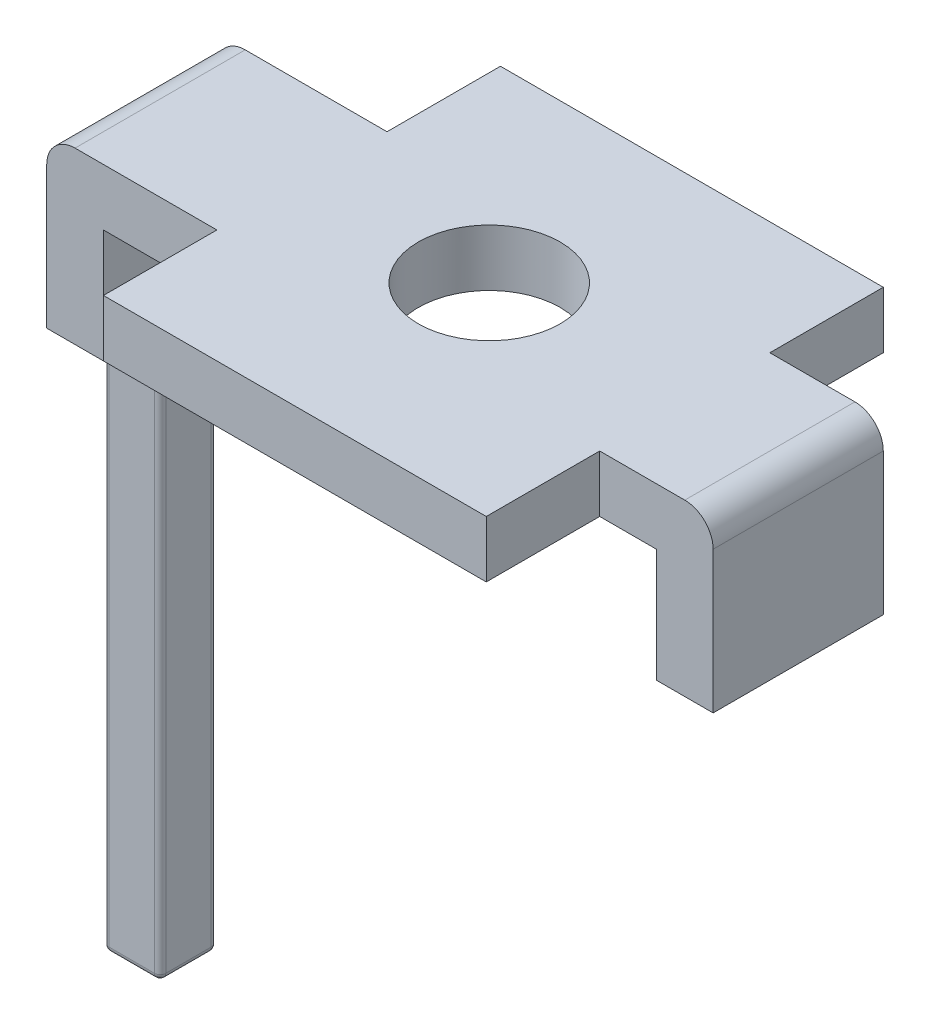
ISO-10303-21;
HEADER;
FILE_DESCRIPTION(('STEP AP214'),'2;1');
FILE_NAME('part.step','',(''),(''),'','','');
FILE_SCHEMA(('AUTOMOTIVE_DESIGN { 1 0 10303 214 1 1 1 1 }'));
ENDSEC;
DATA;
#1=APPLICATION_CONTEXT('core data for automotive mechanical design processes');
#2=APPLICATION_PROTOCOL_DEFINITION('international standard','automotive_design',2000,#1);
#3=PRODUCT_CONTEXT('',#1,'mechanical');
#4=PRODUCT('Part','Part','',(#3));
#5=PRODUCT_RELATED_PRODUCT_CATEGORY('part','',(#4));
#6=PRODUCT_DEFINITION_FORMATION('','',#4);
#7=PRODUCT_DEFINITION_CONTEXT('part definition',#1,'design');
#8=PRODUCT_DEFINITION('design','',#6,#7);
#9=PRODUCT_DEFINITION_SHAPE('','',#8);
#10=(LENGTH_UNIT() NAMED_UNIT(*) SI_UNIT(.MILLI.,.METRE.));
#11=(NAMED_UNIT(*) PLANE_ANGLE_UNIT() SI_UNIT($,.RADIAN.));
#12=(NAMED_UNIT(*) SI_UNIT($,.STERADIAN.) SOLID_ANGLE_UNIT());
#13=UNCERTAINTY_MEASURE_WITH_UNIT(LENGTH_MEASURE(1.E-05),#10,'distance_accuracy_value','');
#14=(GEOMETRIC_REPRESENTATION_CONTEXT(3) GLOBAL_UNCERTAINTY_ASSIGNED_CONTEXT((#13)) GLOBAL_UNIT_ASSIGNED_CONTEXT((#10,
#11,#12)) REPRESENTATION_CONTEXT('',''));
#15=CARTESIAN_POINT('',(0.,0.,0.));
#16=DIRECTION('',(0.,0.,1.));
#17=DIRECTION('',(1.,0.,0.));
#18=AXIS2_PLACEMENT_3D('',#15,#16,#17);
#19=CARTESIAN_POINT('',(2.90000000003594,-6.7,-37.1));
#20=DIRECTION('',(-0.408248290463865,-0.816496580927729,-0.408248290463856));
#21=DIRECTION('',(0.577350269189638,-0.577350269189615,0.577350269189624));
#22=AXIS2_PLACEMENT_3D('',#19,#20,#21);
#23=SPHERICAL_SURFACE('',#22,0.1);
#24=CARTESIAN_POINT('',(2.90000000003594,-6.7,-37.1));
#25=DIRECTION('',(-1.,0.,0.));
#26=DIRECTION('',(0.,-1.,0.));
#27=AXIS2_PLACEMENT_3D('',#24,#25,#26);
#28=CIRCLE('',#27,0.1);
#29=CARTESIAN_POINT('',(2.90000000003594,-6.8,-37.1));
#30=VERTEX_POINT('',#29);
#31=CARTESIAN_POINT('',(2.90000000003594,-6.7,-37.));
#32=VERTEX_POINT('',#31);
#33=EDGE_CURVE('E437',#30,#32,#28,.T.);
#34=ORIENTED_EDGE('',*,*,#33,.F.);
#35=CARTESIAN_POINT('',(2.90000000003594,-6.7,-37.1));
#36=DIRECTION('',(0.,0.,-1.));
#37=DIRECTION('',(1.,0.,0.));
#38=AXIS2_PLACEMENT_3D('',#35,#36,#37);
#39=CIRCLE('',#38,0.1);
#40=CARTESIAN_POINT('',(3.00000000003594,-6.7,-37.1));
#41=VERTEX_POINT('',#40);
#42=EDGE_CURVE('E42',#41,#30,#39,.T.);
#43=ORIENTED_EDGE('',*,*,#42,.F.);
#44=CARTESIAN_POINT('',(2.90000000003594,-6.7,-37.1));
#45=DIRECTION('',(0.,1.,0.));
#46=DIRECTION('',(0.,0.,1.));
#47=AXIS2_PLACEMENT_3D('',#44,#45,#46);
#48=CIRCLE('',#47,0.1);
#49=EDGE_CURVE('E450',#32,#41,#48,.T.);
#50=ORIENTED_EDGE('',*,*,#49,.F.);
#51=EDGE_LOOP('',(#34,#43,#50));
#52=FACE_BOUND('',#51,.T.);
#53=ADVANCED_FACE('F17',(#52),#23,.T.);
#54=CARTESIAN_POINT('',(2.90000000003594,-6.7,-37.9));
#55=DIRECTION('',(-0.408248290463865,-0.816496580927729,0.408248290463856));
#56=DIRECTION('',(0.577350269189638,-0.577350269189615,-0.577350269189624));
#57=AXIS2_PLACEMENT_3D('',#54,#55,#56);
#58=SPHERICAL_SURFACE('',#57,0.1);
#59=CARTESIAN_POINT('',(2.90000000003594,-6.7,-37.9));
#60=DIRECTION('',(0.,0.,1.));
#61=DIRECTION('',(0.,-1.,0.));
#62=AXIS2_PLACEMENT_3D('',#59,#60,#61);
#63=CIRCLE('',#62,0.1);
#64=CARTESIAN_POINT('',(2.90000000003594,-6.8,-37.9));
#65=VERTEX_POINT('',#64);
#66=CARTESIAN_POINT('',(3.00000000003594,-6.7,-37.9));
#67=VERTEX_POINT('',#66);
#68=EDGE_CURVE('E370',#65,#67,#63,.T.);
#69=ORIENTED_EDGE('',*,*,#68,.F.);
#70=CARTESIAN_POINT('',(2.90000000003594,-6.7,-37.9));
#71=DIRECTION('',(-1.,0.,0.));
#72=DIRECTION('',(0.,0.,-1.));
#73=AXIS2_PLACEMENT_3D('',#70,#71,#72);
#74=CIRCLE('',#73,0.1);
#75=CARTESIAN_POINT('',(2.90000000003594,-6.7,-38.));
#76=VERTEX_POINT('',#75);
#77=EDGE_CURVE('E533',#76,#65,#74,.T.);
#78=ORIENTED_EDGE('',*,*,#77,.F.);
#79=CARTESIAN_POINT('',(2.90000000003594,-6.7,-37.9));
#80=DIRECTION('',(0.,1.,0.));
#81=DIRECTION('',(1.,0.,0.));
#82=AXIS2_PLACEMENT_3D('',#79,#80,#81);
#83=CIRCLE('',#82,0.1);
#84=EDGE_CURVE('E383',#67,#76,#83,.T.);
#85=ORIENTED_EDGE('',*,*,#84,.F.);
#86=EDGE_LOOP('',(#69,#78,#85));
#87=FACE_BOUND('',#86,.T.);
#88=ADVANCED_FACE('F757',(#87),#58,.T.);
#89=CARTESIAN_POINT('',(2.10000000003594,-6.7,-37.1));
#90=DIRECTION('',(0.408248290463865,-0.816496580927729,-0.408248290463856));
#91=DIRECTION('',(-0.577350269189638,-0.577350269189615,0.577350269189624));
#92=AXIS2_PLACEMENT_3D('',#89,#90,#91);
#93=SPHERICAL_SURFACE('',#92,0.1);
#94=CARTESIAN_POINT('',(2.10000000003594,-6.7,-37.1));
#95=DIRECTION('',(0.,0.,-1.));
#96=DIRECTION('',(0.,-1.,0.));
#97=AXIS2_PLACEMENT_3D('',#94,#95,#96);
#98=CIRCLE('',#97,0.1);
#99=CARTESIAN_POINT('',(2.10000000003594,-6.8,-37.1));
#100=VERTEX_POINT('',#99);
#101=CARTESIAN_POINT('',(2.00000000003594,-6.7,-37.1));
#102=VERTEX_POINT('',#101);
#103=EDGE_CURVE('E407',#100,#102,#98,.T.);
#104=ORIENTED_EDGE('',*,*,#103,.F.);
#105=CARTESIAN_POINT('',(2.10000000003594,-6.7,-37.1));
#106=DIRECTION('',(1.,0.,0.));
#107=DIRECTION('',(0.,0.,1.));
#108=AXIS2_PLACEMENT_3D('',#105,#106,#107);
#109=CIRCLE('',#108,0.1);
#110=CARTESIAN_POINT('',(2.10000000003594,-6.7,-37.));
#111=VERTEX_POINT('',#110);
#112=EDGE_CURVE('E11',#111,#100,#109,.T.);
#113=ORIENTED_EDGE('',*,*,#112,.F.);
#114=CARTESIAN_POINT('',(2.10000000003594,-6.7,-37.1));
#115=DIRECTION('',(0.,1.,0.));
#116=DIRECTION('',(-1.,0.,0.));
#117=AXIS2_PLACEMENT_3D('',#114,#115,#116);
#118=CIRCLE('',#117,0.1);
#119=EDGE_CURVE('E365',#102,#111,#118,.T.);
#120=ORIENTED_EDGE('',*,*,#119,.F.);
#121=EDGE_LOOP('',(#104,#113,#120));
#122=FACE_BOUND('',#121,.T.);
#123=ADVANCED_FACE('F794',(#122),#93,.T.);
#124=CARTESIAN_POINT('',(2.50000002238594,-6.7,-37.1));
#125=DIRECTION('',(-1.,0.,0.));
#126=DIRECTION('',(0.,-0.707106781186548,0.707106781186548));
#127=AXIS2_PLACEMENT_3D('',#124,#125,#126);
#128=CYLINDRICAL_SURFACE('',#127,0.1);
#129=ORIENTED_EDGE('',*,*,#112,.T.);
#130=DIRECTION('',(1.,0.,0.));
#131=VECTOR('',#130,1.);
#132=CARTESIAN_POINT('',(2.50000002238594,-6.8,-37.1));
#133=LINE('',#132,#131);
#134=EDGE_CURVE('E28',#100,#30,#133,.T.);
#135=ORIENTED_EDGE('',*,*,#134,.T.);
#136=ORIENTED_EDGE('',*,*,#33,.T.);
#137=DIRECTION('',(-1.,0.,0.));
#138=VECTOR('',#137,1.);
#139=CARTESIAN_POINT('',(2.50000002238594,-6.7,-37.));
#140=LINE('',#139,#138);
#141=EDGE_CURVE('E492',#32,#111,#140,.T.);
#142=ORIENTED_EDGE('',*,*,#141,.T.);
#143=EDGE_LOOP('',(#129,#135,#136,#142));
#144=FACE_BOUND('',#143,.T.);
#145=ADVANCED_FACE('F752',(#144),#128,.T.);
#146=CARTESIAN_POINT('',(2.10000000003594,1.95,-37.1));
#147=DIRECTION('',(0.,1.,0.));
#148=DIRECTION('',(-0.707106781186548,0.,0.707106781186548));
#149=AXIS2_PLACEMENT_3D('',#146,#147,#148);
#150=CYLINDRICAL_SURFACE('',#149,0.1);
#151=CARTESIAN_POINT('',(2.10000000003594,3.2,-37.1));
#152=DIRECTION('',(0.,-1.,0.));
#153=DIRECTION('',(-0.707106781186548,0.,0.707106781186548));
#154=AXIS2_PLACEMENT_3D('',#151,#152,#153);
#155=CIRCLE('',#154,0.1);
#156=CARTESIAN_POINT('',(2.10000000003594,3.2,-37.));
#157=VERTEX_POINT('',#156);
#158=CARTESIAN_POINT('',(2.00000000003594,3.2,-37.1));
#159=VERTEX_POINT('',#158);
#160=EDGE_CURVE('E488',#157,#159,#155,.T.);
#161=ORIENTED_EDGE('',*,*,#160,.T.);
#162=DIRECTION('',(0.,-1.,0.));
#163=VECTOR('',#162,1.);
#164=CARTESIAN_POINT('',(2.00000000003594,1.95,-37.1));
#165=LINE('',#164,#163);
#166=EDGE_CURVE('E368',#159,#102,#165,.T.);
#167=ORIENTED_EDGE('',*,*,#166,.T.);
#168=ORIENTED_EDGE('',*,*,#119,.T.);
#169=DIRECTION('',(0.,1.,0.));
#170=VECTOR('',#169,1.);
#171=CARTESIAN_POINT('',(2.10000000003594,1.95,-37.));
#172=LINE('',#171,#170);
#173=EDGE_CURVE('E369',#111,#157,#172,.T.);
#174=ORIENTED_EDGE('',*,*,#173,.T.);
#175=EDGE_LOOP('',(#161,#167,#168,#174));
#176=FACE_BOUND('',#175,.T.);
#177=ADVANCED_FACE('F809',(#176),#150,.T.);
#178=CARTESIAN_POINT('',(2.10000000003594,-6.7,-37.9));
#179=DIRECTION('',(0.408248290463865,-0.816496580927729,0.408248290463856));
#180=DIRECTION('',(-0.577350269189638,-0.577350269189615,-0.577350269189624));
#181=AXIS2_PLACEMENT_3D('',#178,#179,#180);
#182=SPHERICAL_SURFACE('',#181,0.1);
#183=CARTESIAN_POINT('',(2.10000000003594,-6.7,-37.9));
#184=DIRECTION('',(0.,1.,0.));
#185=DIRECTION('',(0.,0.,-1.));
#186=AXIS2_PLACEMENT_3D('',#183,#184,#185);
#187=CIRCLE('',#186,0.1);
#188=CARTESIAN_POINT('',(2.10000000003594,-6.7,-38.));
#189=VERTEX_POINT('',#188);
#190=CARTESIAN_POINT('',(2.00000000003594,-6.7,-37.9));
#191=VERTEX_POINT('',#190);
#192=EDGE_CURVE('E429',#189,#191,#187,.T.);
#193=ORIENTED_EDGE('',*,*,#192,.F.);
#194=CARTESIAN_POINT('',(2.10000000003594,-6.7,-37.9));
#195=DIRECTION('',(1.,0.,0.));
#196=DIRECTION('',(0.,-1.,0.));
#197=AXIS2_PLACEMENT_3D('',#194,#195,#196);
#198=CIRCLE('',#197,0.1);
#199=CARTESIAN_POINT('',(2.10000000003594,-6.8,-37.9));
#200=VERTEX_POINT('',#199);
#201=EDGE_CURVE('E505',#200,#189,#198,.T.);
#202=ORIENTED_EDGE('',*,*,#201,.F.);
#203=CARTESIAN_POINT('',(2.10000000003594,-6.7,-37.9));
#204=DIRECTION('',(0.,0.,1.));
#205=DIRECTION('',(-1.,0.,0.));
#206=AXIS2_PLACEMENT_3D('',#203,#204,#205);
#207=CIRCLE('',#206,0.1);
#208=EDGE_CURVE('E558',#191,#200,#207,.T.);
#209=ORIENTED_EDGE('',*,*,#208,.F.);
#210=EDGE_LOOP('',(#193,#202,#209));
#211=FACE_BOUND('',#210,.T.);
#212=ADVANCED_FACE('F685',(#211),#182,.T.);
#213=CARTESIAN_POINT('',(2.50000002238594,-6.7,-37.9));
#214=DIRECTION('',(1.,0.,0.));
#215=DIRECTION('',(0.,-0.707106781186548,-0.707106781186548));
#216=AXIS2_PLACEMENT_3D('',#213,#214,#215);
#217=CYLINDRICAL_SURFACE('',#216,0.1);
#218=ORIENTED_EDGE('',*,*,#77,.T.);
#219=DIRECTION('',(-1.,0.,0.));
#220=VECTOR('',#219,1.);
#221=CARTESIAN_POINT('',(2.50000002238594,-6.8,-37.9));
#222=LINE('',#221,#220);
#223=EDGE_CURVE('E433',#65,#200,#222,.T.);
#224=ORIENTED_EDGE('',*,*,#223,.T.);
#225=ORIENTED_EDGE('',*,*,#201,.T.);
#226=DIRECTION('',(1.,0.,0.));
#227=VECTOR('',#226,1.);
#228=CARTESIAN_POINT('',(2.50000002238594,-6.7,-38.));
#229=LINE('',#228,#227);
#230=EDGE_CURVE('E509',#189,#76,#229,.T.);
#231=ORIENTED_EDGE('',*,*,#230,.T.);
#232=EDGE_LOOP('',(#218,#224,#225,#231));
#233=FACE_BOUND('',#232,.T.);
#234=ADVANCED_FACE('F19',(#233),#217,.T.);
#235=CARTESIAN_POINT('',(2.10000000003594,-6.7,-37.5));
#236=DIRECTION('',(0.,0.,-1.));
#237=DIRECTION('',(-0.707106781186548,-0.707106781186548,0.));
#238=AXIS2_PLACEMENT_3D('',#235,#236,#237);
#239=CYLINDRICAL_SURFACE('',#238,0.1);
#240=ORIENTED_EDGE('',*,*,#208,.T.);
#241=DIRECTION('',(0.,0.,1.));
#242=VECTOR('',#241,1.);
#243=CARTESIAN_POINT('',(2.10000000003594,-6.8,-37.5));
#244=LINE('',#243,#242);
#245=EDGE_CURVE('E415',#200,#100,#244,.T.);
#246=ORIENTED_EDGE('',*,*,#245,.T.);
#247=ORIENTED_EDGE('',*,*,#103,.T.);
#248=DIRECTION('',(0.,0.,-1.));
#249=VECTOR('',#248,1.);
#250=CARTESIAN_POINT('',(2.00000000003594,-6.7,-37.5));
#251=LINE('',#250,#249);
#252=EDGE_CURVE('E404',#102,#191,#251,.T.);
#253=ORIENTED_EDGE('',*,*,#252,.T.);
#254=EDGE_LOOP('',(#240,#246,#247,#253));
#255=FACE_BOUND('',#254,.T.);
#256=ADVANCED_FACE('F687',(#255),#239,.T.);
#257=CARTESIAN_POINT('',(2.10000000003594,1.95,-37.9));
#258=DIRECTION('',(0.,1.,0.));
#259=DIRECTION('',(-0.707106781186548,0.,-0.707106781186548));
#260=AXIS2_PLACEMENT_3D('',#257,#258,#259);
#261=CYLINDRICAL_SURFACE('',#260,0.1);
#262=CARTESIAN_POINT('',(2.10000000003594,3.2,-37.9));
#263=DIRECTION('',(0.,-1.,0.));
#264=DIRECTION('',(-0.707106781186548,0.,-0.707106781186548));
#265=AXIS2_PLACEMENT_3D('',#262,#263,#264);
#266=CIRCLE('',#265,0.1);
#267=CARTESIAN_POINT('',(2.00000000003594,3.2,-37.9));
#268=VERTEX_POINT('',#267);
#269=CARTESIAN_POINT('',(2.10000000003594,3.2,-38.));
#270=VERTEX_POINT('',#269);
#271=EDGE_CURVE('E408',#268,#270,#266,.T.);
#272=ORIENTED_EDGE('',*,*,#271,.T.);
#273=DIRECTION('',(0.,-1.,0.));
#274=VECTOR('',#273,1.);
#275=CARTESIAN_POINT('',(2.10000000003594,1.95,-38.));
#276=LINE('',#275,#274);
#277=EDGE_CURVE('E419',#270,#189,#276,.T.);
#278=ORIENTED_EDGE('',*,*,#277,.T.);
#279=ORIENTED_EDGE('',*,*,#192,.T.);
#280=DIRECTION('',(0.,1.,0.));
#281=VECTOR('',#280,1.);
#282=CARTESIAN_POINT('',(2.00000000003594,1.95,-37.9));
#283=LINE('',#282,#281);
#284=EDGE_CURVE('E378',#191,#268,#283,.T.);
#285=ORIENTED_EDGE('',*,*,#284,.T.);
#286=EDGE_LOOP('',(#272,#278,#279,#285));
#287=FACE_BOUND('',#286,.T.);
#288=ADVANCED_FACE('F648',(#287),#261,.T.);
#289=CARTESIAN_POINT('',(2.90000000003594,1.2,-37.9));
#290=DIRECTION('',(0.,1.,0.));
#291=DIRECTION('',(0.707106781186548,0.,-0.707106781186548));
#292=AXIS2_PLACEMENT_3D('',#289,#290,#291);
#293=CYLINDRICAL_SURFACE('',#292,0.1);
#294=CARTESIAN_POINT('',(2.90000000003594,3.2,-37.9));
#295=DIRECTION('',(0.,-1.,0.));
#296=DIRECTION('',(0.707106781186548,0.,-0.707106781186548));
#297=AXIS2_PLACEMENT_3D('',#294,#295,#296);
#298=CIRCLE('',#297,0.1);
#299=CARTESIAN_POINT('',(2.90000000003594,3.2,-38.));
#300=VERTEX_POINT('',#299);
#301=CARTESIAN_POINT('',(3.00000000003594,3.2,-37.9));
#302=VERTEX_POINT('',#301);
#303=EDGE_CURVE('E374',#300,#302,#298,.T.);
#304=ORIENTED_EDGE('',*,*,#303,.T.);
#305=DIRECTION('',(0.,-1.,0.));
#306=VECTOR('',#305,1.);
#307=CARTESIAN_POINT('',(3.00000000003594,1.2,-37.9));
#308=LINE('',#307,#306);
#309=EDGE_CURVE('E379',#302,#67,#308,.T.);
#310=ORIENTED_EDGE('',*,*,#309,.T.);
#311=ORIENTED_EDGE('',*,*,#84,.T.);
#312=DIRECTION('',(0.,1.,0.));
#313=VECTOR('',#312,1.);
#314=CARTESIAN_POINT('',(2.90000000003594,1.2,-38.));
#315=LINE('',#314,#313);
#316=EDGE_CURVE('E339',#76,#300,#315,.T.);
#317=ORIENTED_EDGE('',*,*,#316,.T.);
#318=EDGE_LOOP('',(#304,#310,#311,#317));
#319=FACE_BOUND('',#318,.T.);
#320=ADVANCED_FACE('F671',(#319),#293,.T.);
#321=CARTESIAN_POINT('',(2.90000000003594,-6.7,-37.5));
#322=DIRECTION('',(0.,0.,1.));
#323=DIRECTION('',(0.707106781186548,-0.707106781186548,0.));
#324=AXIS2_PLACEMENT_3D('',#321,#322,#323);
#325=CYLINDRICAL_SURFACE('',#324,0.1);
#326=ORIENTED_EDGE('',*,*,#42,.T.);
#327=DIRECTION('',(0.,0.,-1.));
#328=VECTOR('',#327,1.);
#329=CARTESIAN_POINT('',(2.90000000003594,-6.8,-37.5));
#330=LINE('',#329,#328);
#331=EDGE_CURVE('E340',#30,#65,#330,.T.);
#332=ORIENTED_EDGE('',*,*,#331,.T.);
#333=ORIENTED_EDGE('',*,*,#68,.T.);
#334=DIRECTION('',(0.,0.,1.));
#335=VECTOR('',#334,1.);
#336=CARTESIAN_POINT('',(3.00000000003594,-6.7,-37.5));
#337=LINE('',#336,#335);
#338=EDGE_CURVE('E360',#67,#41,#337,.T.);
#339=ORIENTED_EDGE('',*,*,#338,.T.);
#340=EDGE_LOOP('',(#326,#332,#333,#339));
#341=FACE_BOUND('',#340,.T.);
#342=ADVANCED_FACE('F749',(#341),#325,.T.);
#343=CARTESIAN_POINT('',(2.90000000003594,1.2,-37.1));
#344=DIRECTION('',(0.,1.,0.));
#345=DIRECTION('',(0.707106781186548,0.,0.707106781186548));
#346=AXIS2_PLACEMENT_3D('',#343,#344,#345);
#347=CYLINDRICAL_SURFACE('',#346,0.1);
#348=CARTESIAN_POINT('',(2.90000000003594,3.2,-37.1));
#349=DIRECTION('',(0.,-1.,0.));
#350=DIRECTION('',(0.707106781186548,0.,0.707106781186548));
#351=AXIS2_PLACEMENT_3D('',#348,#349,#350);
#352=CIRCLE('',#351,0.1);
#353=CARTESIAN_POINT('',(3.00000000003594,3.2,-37.1));
#354=VERTEX_POINT('',#353);
#355=CARTESIAN_POINT('',(2.90000000003594,3.2,-37.));
#356=VERTEX_POINT('',#355);
#357=EDGE_CURVE('E356',#354,#356,#352,.T.);
#358=ORIENTED_EDGE('',*,*,#357,.T.);
#359=DIRECTION('',(0.,-1.,0.));
#360=VECTOR('',#359,1.);
#361=CARTESIAN_POINT('',(2.90000000003594,1.2,-37.));
#362=LINE('',#361,#360);
#363=EDGE_CURVE('E361',#356,#32,#362,.T.);
#364=ORIENTED_EDGE('',*,*,#363,.T.);
#365=ORIENTED_EDGE('',*,*,#49,.T.);
#366=DIRECTION('',(0.,1.,0.));
#367=VECTOR('',#366,1.);
#368=CARTESIAN_POINT('',(3.00000000003594,1.2,-37.1));
#369=LINE('',#368,#367);
#370=EDGE_CURVE('E448',#41,#354,#369,.T.);
#371=ORIENTED_EDGE('',*,*,#370,.T.);
#372=EDGE_LOOP('',(#358,#364,#365,#371));
#373=FACE_BOUND('',#372,.T.);
#374=ADVANCED_FACE('F746',(#373),#347,.T.);
#375=CARTESIAN_POINT('',(2.00000000003594,5.7,-37.5));
#376=DIRECTION('',(-1.,0.,0.));
#377=DIRECTION('',(0.,0.,1.));
#378=AXIS2_PLACEMENT_3D('',#375,#376,#377);
#379=PLANE('',#378);
#380=DIRECTION('',(0.,0.,-1.));
#381=VECTOR('',#380,1.);
#382=CARTESIAN_POINT('',(2.00000000003594,3.2,-37.5));
#383=LINE('',#382,#381);
#384=CARTESIAN_POINT('',(2.00000000003594,3.2,-39.));
#385=VERTEX_POINT('',#384);
#386=EDGE_CURVE('E478',#268,#385,#383,.T.);
#387=ORIENTED_EDGE('',*,*,#386,.F.);
#388=ORIENTED_EDGE('',*,*,#284,.F.);
#389=ORIENTED_EDGE('',*,*,#252,.F.);
#390=ORIENTED_EDGE('',*,*,#166,.F.);
#391=DIRECTION('',(0.,0.,-1.));
#392=VECTOR('',#391,1.);
#393=CARTESIAN_POINT('',(2.00000000003594,3.2,-37.5));
#394=LINE('',#393,#392);
#395=CARTESIAN_POINT('',(2.00000000003594,3.2,-36.));
#396=VERTEX_POINT('',#395);
#397=EDGE_CURVE('E387',#396,#159,#394,.T.);
#398=ORIENTED_EDGE('',*,*,#397,.F.);
#399=DIRECTION('',(0.,1.,0.));
#400=VECTOR('',#399,1.);
#401=CARTESIAN_POINT('',(2.00000000003594,5.7,-36.));
#402=LINE('',#401,#400);
#403=CARTESIAN_POINT('',(2.00000000003594,5.7,-36.));
#404=VERTEX_POINT('',#403);
#405=EDGE_CURVE('E451',#396,#404,#402,.T.);
#406=ORIENTED_EDGE('',*,*,#405,.T.);
#407=DIRECTION('',(0.,0.,1.));
#408=VECTOR('',#407,1.);
#409=CARTESIAN_POINT('',(2.00000000003594,5.7,-37.5));
#410=LINE('',#409,#408);
#411=CARTESIAN_POINT('',(2.00000000003594,5.7,-39.));
#412=VERTEX_POINT('',#411);
#413=EDGE_CURVE('E461',#412,#404,#410,.T.);
#414=ORIENTED_EDGE('',*,*,#413,.F.);
#415=DIRECTION('',(0.,-1.,0.));
#416=VECTOR('',#415,1.);
#417=CARTESIAN_POINT('',(2.00000000003594,5.7,-39.));
#418=LINE('',#417,#416);
#419=EDGE_CURVE('E21',#412,#385,#418,.T.);
#420=ORIENTED_EDGE('',*,*,#419,.T.);
#421=EDGE_LOOP('',(#387,#388,#389,#390,#398,#406,#414,#420));
#422=FACE_BOUND('',#421,.T.);
#423=ADVANCED_FACE('F656',(#422),#379,.T.);
#424=CARTESIAN_POINT('',(2.50000002238594,-1.8,-37.));
#425=DIRECTION('',(0.,0.,-1.));
#426=DIRECTION('',(0.,-1.,0.));
#427=AXIS2_PLACEMENT_3D('',#424,#425,#426);
#428=PLANE('',#427);
#429=ORIENTED_EDGE('',*,*,#173,.F.);
#430=ORIENTED_EDGE('',*,*,#141,.F.);
#431=ORIENTED_EDGE('',*,*,#363,.F.);
#432=DIRECTION('',(1.,0.,0.));
#433=VECTOR('',#432,1.);
#434=CARTESIAN_POINT('',(2.50000001121094,3.2,-37.));
#435=LINE('',#434,#433);
#436=EDGE_CURVE('E495',#157,#356,#435,.T.);
#437=ORIENTED_EDGE('',*,*,#436,.F.);
#438=EDGE_LOOP('',(#429,#430,#431,#437));
#439=FACE_BOUND('',#438,.T.);
#440=ADVANCED_FACE('F840',(#439),#428,.F.);
#441=CARTESIAN_POINT('',(2.50000002238594,-6.8,-37.5));
#442=DIRECTION('',(0.,-1.,0.));
#443=DIRECTION('',(0.,0.,-1.));
#444=AXIS2_PLACEMENT_3D('',#441,#442,#443);
#445=PLANE('',#444);
#446=ORIENTED_EDGE('',*,*,#223,.F.);
#447=ORIENTED_EDGE('',*,*,#331,.F.);
#448=ORIENTED_EDGE('',*,*,#134,.F.);
#449=ORIENTED_EDGE('',*,*,#245,.F.);
#450=EDGE_LOOP('',(#446,#447,#448,#449));
#451=FACE_BOUND('',#450,.T.);
#452=ADVANCED_FACE('F754',(#451),#445,.T.);
#453=CARTESIAN_POINT('',(13.2499996591359,5.7,-37.5));
#454=DIRECTION('',(0.,0.,1.));
#455=DIRECTION('',(0.707106781186549,0.707106781186546,0.));
#456=AXIS2_PLACEMENT_3D('',#453,#454,#455);
#457=CYLINDRICAL_SURFACE('',#456,0.5);
#458=CARTESIAN_POINT('',(13.2499996591359,5.7,-36.));
#459=DIRECTION('',(0.,0.,-1.));
#460=DIRECTION('',(0.707106781186549,0.707106781186546,0.));
#461=AXIS2_PLACEMENT_3D('',#458,#459,#460);
#462=CIRCLE('',#461,0.5);
#463=CARTESIAN_POINT('',(13.2499996591359,6.2,-36.));
#464=VERTEX_POINT('',#463);
#465=CARTESIAN_POINT('',(13.7499996591359,5.7,-36.));
#466=VERTEX_POINT('',#465);
#467=EDGE_CURVE('E608',#464,#466,#462,.T.);
#468=ORIENTED_EDGE('',*,*,#467,.T.);
#469=DIRECTION('',(0.,0.,-1.));
#470=VECTOR('',#469,1.);
#471=CARTESIAN_POINT('',(13.7499996591359,5.7,-37.5));
#472=LINE('',#471,#470);
#473=CARTESIAN_POINT('',(13.7499996591359,5.7,-39.));
#474=VERTEX_POINT('',#473);
#475=EDGE_CURVE('E604',#466,#474,#472,.T.);
#476=ORIENTED_EDGE('',*,*,#475,.T.);
#477=CARTESIAN_POINT('',(13.2499996591359,5.7,-39.));
#478=DIRECTION('',(0.,0.,1.));
#479=DIRECTION('',(0.707106781186549,0.707106781186546,0.));
#480=AXIS2_PLACEMENT_3D('',#477,#478,#479);
#481=CIRCLE('',#480,0.5);
#482=CARTESIAN_POINT('',(13.2499996591359,6.2,-39.));
#483=VERTEX_POINT('',#482);
#484=EDGE_CURVE('E244',#474,#483,#481,.T.);
#485=ORIENTED_EDGE('',*,*,#484,.T.);
#486=DIRECTION('',(0.,0.,1.));
#487=VECTOR('',#486,1.);
#488=CARTESIAN_POINT('',(13.2499996591359,6.2,-37.5));
#489=LINE('',#488,#487);
#490=EDGE_CURVE('E254',#483,#464,#489,.T.);
#491=ORIENTED_EDGE('',*,*,#490,.T.);
#492=EDGE_LOOP('',(#468,#476,#485,#491));
#493=FACE_BOUND('',#492,.T.);
#494=ADVANCED_FACE('F808',(#493),#457,.T.);
#495=CARTESIAN_POINT('',(12.7499996591359,5.7,-39.));
#496=DIRECTION('',(0.,0.,1.));
#497=DIRECTION('',(1.,0.,0.));
#498=AXIS2_PLACEMENT_3D('',#495,#496,#497);
#499=PLANE('',#498);
#500=ORIENTED_EDGE('',*,*,#484,.F.);
#501=DIRECTION('',(0.,1.,0.));
#502=VECTOR('',#501,1.);
#503=CARTESIAN_POINT('',(13.7499996591359,5.7,-39.));
#504=LINE('',#503,#502);
#505=CARTESIAN_POINT('',(13.7499996591359,3.2,-39.));
#506=VERTEX_POINT('',#505);
#507=EDGE_CURVE('E312',#506,#474,#504,.T.);
#508=ORIENTED_EDGE('',*,*,#507,.F.);
#509=DIRECTION('',(1.,0.,0.));
#510=VECTOR('',#509,1.);
#511=CARTESIAN_POINT('',(13.2499996591359,3.2,-39.));
#512=LINE('',#511,#510);
#513=CARTESIAN_POINT('',(12.7499996591359,3.2,-39.));
#514=VERTEX_POINT('',#513);
#515=EDGE_CURVE('E299',#514,#506,#512,.T.);
#516=ORIENTED_EDGE('',*,*,#515,.F.);
#517=DIRECTION('',(0.,1.,0.));
#518=VECTOR('',#517,1.);
#519=CARTESIAN_POINT('',(12.7499996591359,4.2,-39.));
#520=LINE('',#519,#518);
#521=CARTESIAN_POINT('',(12.7499996591359,5.2,-39.));
#522=VERTEX_POINT('',#521);
#523=EDGE_CURVE('E362',#514,#522,#520,.T.);
#524=ORIENTED_EDGE('',*,*,#523,.T.);
#525=DIRECTION('',(-1.,0.,0.));
#526=VECTOR('',#525,1.);
#527=CARTESIAN_POINT('',(12.7499996591359,5.2,-39.));
#528=LINE('',#527,#526);
#529=CARTESIAN_POINT('',(11.7499996591359,5.2,-39.));
#530=VERTEX_POINT('',#529);
#531=EDGE_CURVE('E316',#522,#530,#528,.T.);
#532=ORIENTED_EDGE('',*,*,#531,.T.);
#533=DIRECTION('',(0.,-1.,0.));
#534=VECTOR('',#533,1.);
#535=CARTESIAN_POINT('',(11.7499996591359,5.7,-39.));
#536=LINE('',#535,#534);
#537=CARTESIAN_POINT('',(11.7499996591359,6.2,-39.));
#538=VERTEX_POINT('',#537);
#539=EDGE_CURVE('E396',#538,#530,#536,.T.);
#540=ORIENTED_EDGE('',*,*,#539,.F.);
#541=DIRECTION('',(-1.,0.,0.));
#542=VECTOR('',#541,1.);
#543=CARTESIAN_POINT('',(12.7499996591359,6.2,-39.));
#544=LINE('',#543,#542);
#545=EDGE_CURVE('E397',#483,#538,#544,.T.);
#546=ORIENTED_EDGE('',*,*,#545,.F.);
#547=EDGE_LOOP('',(#500,#508,#516,#524,#532,#540,#546));
#548=FACE_BOUND('',#547,.T.);
#549=ADVANCED_FACE('F313',(#548),#499,.F.);
#550=CARTESIAN_POINT('',(13.7499996591359,5.7,-37.5));
#551=DIRECTION('',(1.,0.,0.));
#552=DIRECTION('',(0.,1.,0.));
#553=AXIS2_PLACEMENT_3D('',#550,#551,#552);
#554=PLANE('',#553);
#555=ORIENTED_EDGE('',*,*,#475,.F.);
#556=DIRECTION('',(0.,1.,0.));
#557=VECTOR('',#556,1.);
#558=CARTESIAN_POINT('',(13.7499996591359,4.2,-36.));
#559=LINE('',#558,#557);
#560=CARTESIAN_POINT('',(13.7499996591359,3.2,-36.));
#561=VERTEX_POINT('',#560);
#562=EDGE_CURVE('E321',#561,#466,#559,.T.);
#563=ORIENTED_EDGE('',*,*,#562,.F.);
#564=DIRECTION('',(0.,0.,1.));
#565=VECTOR('',#564,1.);
#566=CARTESIAN_POINT('',(13.7499996591359,3.2,-37.5));
#567=LINE('',#566,#565);
#568=EDGE_CURVE('E303',#506,#561,#567,.T.);
#569=ORIENTED_EDGE('',*,*,#568,.F.);
#570=ORIENTED_EDGE('',*,*,#507,.T.);
#571=EDGE_LOOP('',(#555,#563,#569,#570));
#572=FACE_BOUND('',#571,.T.);
#573=ADVANCED_FACE('F319',(#572),#554,.T.);
#574=CARTESIAN_POINT('',(2.50000000003594,5.7,-37.5));
#575=DIRECTION('',(0.,0.,-1.));
#576=DIRECTION('',(-0.707106781186548,0.707106781186548,0.));
#577=AXIS2_PLACEMENT_3D('',#574,#575,#576);
#578=CYLINDRICAL_SURFACE('',#577,0.5);
#579=CARTESIAN_POINT('',(2.50000000003594,5.7,-39.));
#580=DIRECTION('',(0.,0.,1.));
#581=DIRECTION('',(-0.707106781186548,0.707106781186548,0.));
#582=AXIS2_PLACEMENT_3D('',#579,#580,#581);
#583=CIRCLE('',#582,0.5);
#584=CARTESIAN_POINT('',(2.50000000003594,6.2,-39.));
#585=VERTEX_POINT('',#584);
#586=EDGE_CURVE('E317',#585,#412,#583,.T.);
#587=ORIENTED_EDGE('',*,*,#586,.T.);
#588=ORIENTED_EDGE('',*,*,#413,.T.);
#589=CARTESIAN_POINT('',(2.50000000003594,5.7,-36.));
#590=DIRECTION('',(0.,0.,-1.));
#591=DIRECTION('',(-0.707106781186548,0.707106781186548,0.));
#592=AXIS2_PLACEMENT_3D('',#589,#590,#591);
#593=CIRCLE('',#592,0.5);
#594=CARTESIAN_POINT('',(2.50000000003594,6.2,-36.));
#595=VERTEX_POINT('',#594);
#596=EDGE_CURVE('E454',#404,#595,#593,.T.);
#597=ORIENTED_EDGE('',*,*,#596,.T.);
#598=DIRECTION('',(0.,0.,-1.));
#599=VECTOR('',#598,1.);
#600=CARTESIAN_POINT('',(2.50000000003594,6.2,-37.5));
#601=LINE('',#600,#599);
#602=EDGE_CURVE('E452',#595,#585,#601,.T.);
#603=ORIENTED_EDGE('',*,*,#602,.T.);
#604=EDGE_LOOP('',(#587,#588,#597,#603));
#605=FACE_BOUND('',#604,.T.);
#606=ADVANCED_FACE('F738',(#605),#578,.T.);
#607=CARTESIAN_POINT('',(3.50000000003594,5.7,-36.));
#608=DIRECTION('',(0.,0.,-1.));
#609=DIRECTION('',(0.,-1.,0.));
#610=AXIS2_PLACEMENT_3D('',#607,#608,#609);
#611=PLANE('',#610);
#612=ORIENTED_EDGE('',*,*,#596,.F.);
#613=ORIENTED_EDGE('',*,*,#405,.F.);
#614=DIRECTION('',(-1.,0.,0.));
#615=VECTOR('',#614,1.);
#616=CARTESIAN_POINT('',(2.50000000003594,3.2,-36.));
#617=LINE('',#616,#615);
#618=CARTESIAN_POINT('',(3.00000000003594,3.2,-36.));
#619=VERTEX_POINT('',#618);
#620=EDGE_CURVE('E513',#619,#396,#617,.T.);
#621=ORIENTED_EDGE('',*,*,#620,.F.);
#622=DIRECTION('',(0.,1.,0.));
#623=VECTOR('',#622,1.);
#624=CARTESIAN_POINT('',(3.00000000003594,4.2,-36.));
#625=LINE('',#624,#623);
#626=CARTESIAN_POINT('',(3.00000000003594,5.2,-36.));
#627=VERTEX_POINT('',#626);
#628=EDGE_CURVE('E332',#619,#627,#625,.T.);
#629=ORIENTED_EDGE('',*,*,#628,.T.);
#630=DIRECTION('',(1.,0.,0.));
#631=VECTOR('',#630,1.);
#632=CARTESIAN_POINT('',(3.50000000003594,5.2,-36.));
#633=LINE('',#632,#631);
#634=CARTESIAN_POINT('',(5.00000000003594,5.2,-36.));
#635=VERTEX_POINT('',#634);
#636=EDGE_CURVE('E464',#627,#635,#633,.T.);
#637=ORIENTED_EDGE('',*,*,#636,.T.);
#638=DIRECTION('',(0.,-1.,0.));
#639=VECTOR('',#638,1.);
#640=CARTESIAN_POINT('',(5.00000000003594,5.7,-36.));
#641=LINE('',#640,#639);
#642=CARTESIAN_POINT('',(5.00000000003594,6.2,-36.));
#643=VERTEX_POINT('',#642);
#644=EDGE_CURVE('E309',#643,#635,#641,.T.);
#645=ORIENTED_EDGE('',*,*,#644,.F.);
#646=DIRECTION('',(1.,0.,0.));
#647=VECTOR('',#646,1.);
#648=CARTESIAN_POINT('',(3.50000000003594,6.2,-36.));
#649=LINE('',#648,#647);
#650=EDGE_CURVE('E484',#595,#643,#649,.T.);
#651=ORIENTED_EDGE('',*,*,#650,.F.);
#652=EDGE_LOOP('',(#612,#613,#621,#629,#637,#645,#651));
#653=FACE_BOUND('',#652,.T.);
#654=ADVANCED_FACE('F734',(#653),#611,.F.);
#655=CARTESIAN_POINT('',(2.50000002238594,-1.8,-38.));
#656=DIRECTION('',(0.,0.,1.));
#657=DIRECTION('',(1.,0.,0.));
#658=AXIS2_PLACEMENT_3D('',#655,#656,#657);
#659=PLANE('',#658);
#660=ORIENTED_EDGE('',*,*,#277,.F.);
#661=DIRECTION('',(-1.,0.,0.));
#662=VECTOR('',#661,1.);
#663=CARTESIAN_POINT('',(2.50000001121094,3.2,-38.));
#664=LINE('',#663,#662);
#665=EDGE_CURVE('E471',#300,#270,#664,.T.);
#666=ORIENTED_EDGE('',*,*,#665,.F.);
#667=ORIENTED_EDGE('',*,*,#316,.F.);
#668=ORIENTED_EDGE('',*,*,#230,.F.);
#669=EDGE_LOOP('',(#660,#666,#667,#668));
#670=FACE_BOUND('',#669,.T.);
#671=ADVANCED_FACE('F676',(#670),#659,.F.);
#672=CARTESIAN_POINT('',(2.50000000003594,3.2,-37.5));
#673=DIRECTION('',(0.,-1.,0.));
#674=DIRECTION('',(0.,0.,-1.));
#675=AXIS2_PLACEMENT_3D('',#672,#673,#674);
#676=PLANE('',#675);
#677=ORIENTED_EDGE('',*,*,#665,.T.);
#678=ORIENTED_EDGE('',*,*,#271,.F.);
#679=ORIENTED_EDGE('',*,*,#386,.T.);
#680=DIRECTION('',(1.,0.,0.));
#681=VECTOR('',#680,1.);
#682=CARTESIAN_POINT('',(2.50000000003594,3.2,-39.));
#683=LINE('',#682,#681);
#684=CARTESIAN_POINT('',(3.00000000003594,3.2,-39.));
#685=VERTEX_POINT('',#684);
#686=EDGE_CURVE('E536',#385,#685,#683,.T.);
#687=ORIENTED_EDGE('',*,*,#686,.T.);
#688=DIRECTION('',(0.,0.,1.));
#689=VECTOR('',#688,1.);
#690=CARTESIAN_POINT('',(3.00000000003594,3.2,-37.5));
#691=LINE('',#690,#689);
#692=EDGE_CURVE('E499',#685,#302,#691,.T.);
#693=ORIENTED_EDGE('',*,*,#692,.T.);
#694=ORIENTED_EDGE('',*,*,#303,.F.);
#695=EDGE_LOOP('',(#677,#678,#679,#687,#693,#694));
#696=FACE_BOUND('',#695,.T.);
#697=ADVANCED_FACE('F652',(#696),#676,.T.);
#698=CARTESIAN_POINT('',(2.50000000003594,3.2,-37.5));
#699=DIRECTION('',(0.,-1.,0.));
#700=DIRECTION('',(0.,0.,-1.));
#701=AXIS2_PLACEMENT_3D('',#698,#699,#700);
#702=PLANE('',#701);
#703=ORIENTED_EDGE('',*,*,#436,.T.);
#704=ORIENTED_EDGE('',*,*,#357,.F.);
#705=DIRECTION('',(0.,0.,1.));
#706=VECTOR('',#705,1.);
#707=CARTESIAN_POINT('',(3.00000000003594,3.2,-37.5));
#708=LINE('',#707,#706);
#709=EDGE_CURVE('E500',#354,#619,#708,.T.);
#710=ORIENTED_EDGE('',*,*,#709,.T.);
#711=ORIENTED_EDGE('',*,*,#620,.T.);
#712=ORIENTED_EDGE('',*,*,#397,.T.);
#713=ORIENTED_EDGE('',*,*,#160,.F.);
#714=EDGE_LOOP('',(#703,#704,#710,#711,#712,#713));
#715=FACE_BOUND('',#714,.T.);
#716=ADVANCED_FACE('F741',(#715),#702,.T.);
#717=CARTESIAN_POINT('',(3.00000000003594,4.2,-37.5));
#718=DIRECTION('',(-1.,0.,0.));
#719=DIRECTION('',(0.,0.,1.));
#720=AXIS2_PLACEMENT_3D('',#717,#718,#719);
#721=PLANE('',#720);
#722=ORIENTED_EDGE('',*,*,#692,.F.);
#723=DIRECTION('',(0.,1.,0.));
#724=VECTOR('',#723,1.);
#725=CARTESIAN_POINT('',(3.00000000003594,4.2,-39.));
#726=LINE('',#725,#724);
#727=CARTESIAN_POINT('',(3.00000000003594,5.2,-39.));
#728=VERTEX_POINT('',#727);
#729=EDGE_CURVE('E384',#685,#728,#726,.T.);
#730=ORIENTED_EDGE('',*,*,#729,.T.);
#731=DIRECTION('',(0.,0.,-1.));
#732=VECTOR('',#731,1.);
#733=CARTESIAN_POINT('',(3.00000000003594,5.2,-37.5));
#734=LINE('',#733,#732);
#735=EDGE_CURVE('E545',#627,#728,#734,.T.);
#736=ORIENTED_EDGE('',*,*,#735,.F.);
#737=ORIENTED_EDGE('',*,*,#628,.F.);
#738=ORIENTED_EDGE('',*,*,#709,.F.);
#739=ORIENTED_EDGE('',*,*,#370,.F.);
#740=ORIENTED_EDGE('',*,*,#338,.F.);
#741=ORIENTED_EDGE('',*,*,#309,.F.);
#742=EDGE_LOOP('',(#722,#730,#736,#737,#738,#739,#740,#741));
#743=FACE_BOUND('',#742,.T.);
#744=ADVANCED_FACE('F667',(#743),#721,.F.);
#745=CARTESIAN_POINT('',(3.50000000003594,5.7,-39.));
#746=DIRECTION('',(0.,0.,1.));
#747=DIRECTION('',(1.,0.,0.));
#748=AXIS2_PLACEMENT_3D('',#745,#746,#747);
#749=PLANE('',#748);
#750=ORIENTED_EDGE('',*,*,#586,.F.);
#751=DIRECTION('',(1.,0.,0.));
#752=VECTOR('',#751,1.);
#753=CARTESIAN_POINT('',(3.50000000003594,6.2,-39.));
#754=LINE('',#753,#752);
#755=CARTESIAN_POINT('',(5.00000000003594,6.2,-39.));
#756=VERTEX_POINT('',#755);
#757=EDGE_CURVE('E388',#585,#756,#754,.T.);
#758=ORIENTED_EDGE('',*,*,#757,.T.);
#759=DIRECTION('',(0.,1.,0.));
#760=VECTOR('',#759,1.);
#761=CARTESIAN_POINT('',(5.00000000003594,5.7,-39.));
#762=LINE('',#761,#760);
#763=CARTESIAN_POINT('',(5.00000000003594,5.2,-39.));
#764=VERTEX_POINT('',#763);
#765=EDGE_CURVE('E336',#764,#756,#762,.T.);
#766=ORIENTED_EDGE('',*,*,#765,.F.);
#767=DIRECTION('',(1.,0.,0.));
#768=VECTOR('',#767,1.);
#769=CARTESIAN_POINT('',(3.50000000003594,5.2,-39.));
#770=LINE('',#769,#768);
#771=EDGE_CURVE('E634',#728,#764,#770,.T.);
#772=ORIENTED_EDGE('',*,*,#771,.F.);
#773=ORIENTED_EDGE('',*,*,#729,.F.);
#774=ORIENTED_EDGE('',*,*,#686,.F.);
#775=ORIENTED_EDGE('',*,*,#419,.F.);
#776=EDGE_LOOP('',(#750,#758,#766,#772,#773,#774,#775));
#777=FACE_BOUND('',#776,.T.);
#778=ADVANCED_FACE('F664',(#777),#749,.F.);
#779=CARTESIAN_POINT('',(5.00000000003594,5.7,-37.5));
#780=DIRECTION('',(1.,0.,0.));
#781=DIRECTION('',(0.,1.,0.));
#782=AXIS2_PLACEMENT_3D('',#779,#780,#781);
#783=PLANE('',#782);
#784=ORIENTED_EDGE('',*,*,#765,.T.);
#785=DIRECTION('',(0.,0.,1.));
#786=VECTOR('',#785,1.);
#787=CARTESIAN_POINT('',(5.00000000003594,6.2,-37.5));
#788=LINE('',#787,#786);
#789=CARTESIAN_POINT('',(5.00000000003594,6.2,-41.));
#790=VERTEX_POINT('',#789);
#791=EDGE_CURVE('E281',#790,#756,#788,.T.);
#792=ORIENTED_EDGE('',*,*,#791,.F.);
#793=DIRECTION('',(0.,-1.,0.));
#794=VECTOR('',#793,1.);
#795=CARTESIAN_POINT('',(5.00000000003594,5.7,-41.));
#796=LINE('',#795,#794);
#797=CARTESIAN_POINT('',(5.00000000003594,5.2,-41.));
#798=VERTEX_POINT('',#797);
#799=EDGE_CURVE('E334',#790,#798,#796,.T.);
#800=ORIENTED_EDGE('',*,*,#799,.T.);
#801=DIRECTION('',(0.,0.,-1.));
#802=VECTOR('',#801,1.);
#803=CARTESIAN_POINT('',(5.00000000003594,5.2,-37.5));
#804=LINE('',#803,#802);
#805=EDGE_CURVE('E271',#764,#798,#804,.T.);
#806=ORIENTED_EDGE('',*,*,#805,.F.);
#807=EDGE_LOOP('',(#784,#792,#800,#806));
#808=FACE_BOUND('',#807,.T.);
#809=ADVANCED_FACE('F700',(#808),#783,.F.);
#810=CARTESIAN_POINT('',(5.00000000003594,5.7,-37.5));
#811=DIRECTION('',(1.,0.,0.));
#812=DIRECTION('',(0.,1.,0.));
#813=AXIS2_PLACEMENT_3D('',#810,#811,#812);
#814=PLANE('',#813);
#815=ORIENTED_EDGE('',*,*,#644,.T.);
#816=DIRECTION('',(0.,0.,-1.));
#817=VECTOR('',#816,1.);
#818=CARTESIAN_POINT('',(5.00000000003594,5.2,-37.5));
#819=LINE('',#818,#817);
#820=CARTESIAN_POINT('',(5.00000000003594,5.2,-34.));
#821=VERTEX_POINT('',#820);
#822=EDGE_CURVE('E347',#821,#635,#819,.T.);
#823=ORIENTED_EDGE('',*,*,#822,.F.);
#824=DIRECTION('',(0.,-1.,0.));
#825=VECTOR('',#824,1.);
#826=CARTESIAN_POINT('',(5.00000000003594,5.7,-34.));
#827=LINE('',#826,#825);
#828=CARTESIAN_POINT('',(5.00000000003594,6.2,-34.));
#829=VERTEX_POINT('',#828);
#830=EDGE_CURVE('E441',#829,#821,#827,.T.);
#831=ORIENTED_EDGE('',*,*,#830,.F.);
#832=DIRECTION('',(0.,0.,1.));
#833=VECTOR('',#832,1.);
#834=CARTESIAN_POINT('',(5.00000000003594,6.2,-37.5));
#835=LINE('',#834,#833);
#836=EDGE_CURVE('E345',#643,#829,#835,.T.);
#837=ORIENTED_EDGE('',*,*,#836,.F.);
#838=EDGE_LOOP('',(#815,#823,#831,#837));
#839=FACE_BOUND('',#838,.T.);
#840=ADVANCED_FACE('F730',(#839),#814,.F.);
#841=CARTESIAN_POINT('',(13.2499996591359,3.2,-37.5));
#842=DIRECTION('',(0.,-1.,0.));
#843=DIRECTION('',(0.,0.,-1.));
#844=AXIS2_PLACEMENT_3D('',#841,#842,#843);
#845=PLANE('',#844);
#846=ORIENTED_EDGE('',*,*,#515,.T.);
#847=ORIENTED_EDGE('',*,*,#568,.T.);
#848=DIRECTION('',(-1.,0.,0.));
#849=VECTOR('',#848,1.);
#850=CARTESIAN_POINT('',(13.2499996591359,3.2,-36.));
#851=LINE('',#850,#849);
#852=CARTESIAN_POINT('',(12.7499996591359,3.2,-36.));
#853=VERTEX_POINT('',#852);
#854=EDGE_CURVE('E323',#561,#853,#851,.T.);
#855=ORIENTED_EDGE('',*,*,#854,.T.);
#856=DIRECTION('',(0.,0.,-1.));
#857=VECTOR('',#856,1.);
#858=CARTESIAN_POINT('',(12.7499996591359,3.2,-37.5));
#859=LINE('',#858,#857);
#860=EDGE_CURVE('E305',#853,#514,#859,.T.);
#861=ORIENTED_EDGE('',*,*,#860,.T.);
#862=EDGE_LOOP('',(#846,#847,#855,#861));
#863=FACE_BOUND('',#862,.T.);
#864=ADVANCED_FACE('F300',(#863),#845,.T.);
#865=CARTESIAN_POINT('',(12.7499996591359,4.2,-37.5));
#866=DIRECTION('',(1.,0.,0.));
#867=DIRECTION('',(0.,1.,0.));
#868=AXIS2_PLACEMENT_3D('',#865,#866,#867);
#869=PLANE('',#868);
#870=DIRECTION('',(0.,1.,0.));
#871=VECTOR('',#870,1.);
#872=CARTESIAN_POINT('',(12.7499996591359,4.2,-36.));
#873=LINE('',#872,#871);
#874=CARTESIAN_POINT('',(12.7499996591359,5.2,-36.));
#875=VERTEX_POINT('',#874);
#876=EDGE_CURVE('E542',#853,#875,#873,.T.);
#877=ORIENTED_EDGE('',*,*,#876,.T.);
#878=DIRECTION('',(0.,0.,1.));
#879=VECTOR('',#878,1.);
#880=CARTESIAN_POINT('',(12.7499996591359,5.2,-37.5));
#881=LINE('',#880,#879);
#882=EDGE_CURVE('E578',#522,#875,#881,.T.);
#883=ORIENTED_EDGE('',*,*,#882,.F.);
#884=ORIENTED_EDGE('',*,*,#523,.F.);
#885=ORIENTED_EDGE('',*,*,#860,.F.);
#886=EDGE_LOOP('',(#877,#883,#884,#885));
#887=FACE_BOUND('',#886,.T.);
#888=ADVANCED_FACE('F712',(#887),#869,.F.);
#889=CARTESIAN_POINT('',(12.7499996591359,5.7,-36.));
#890=DIRECTION('',(0.,0.,-1.));
#891=DIRECTION('',(0.,-1.,0.));
#892=AXIS2_PLACEMENT_3D('',#889,#890,#891);
#893=PLANE('',#892);
#894=ORIENTED_EDGE('',*,*,#467,.F.);
#895=DIRECTION('',(-1.,0.,0.));
#896=VECTOR('',#895,1.);
#897=CARTESIAN_POINT('',(12.7499996591359,6.2,-36.));
#898=LINE('',#897,#896);
#899=CARTESIAN_POINT('',(11.7499996591359,6.2,-36.));
#900=VERTEX_POINT('',#899);
#901=EDGE_CURVE('E446',#464,#900,#898,.T.);
#902=ORIENTED_EDGE('',*,*,#901,.T.);
#903=DIRECTION('',(0.,1.,0.));
#904=VECTOR('',#903,1.);
#905=CARTESIAN_POINT('',(11.7499996591359,5.7,-36.));
#906=LINE('',#905,#904);
#907=CARTESIAN_POINT('',(11.7499996591359,5.2,-36.));
#908=VERTEX_POINT('',#907);
#909=EDGE_CURVE('E447',#908,#900,#906,.T.);
#910=ORIENTED_EDGE('',*,*,#909,.F.);
#911=DIRECTION('',(-1.,0.,0.));
#912=VECTOR('',#911,1.);
#913=CARTESIAN_POINT('',(12.7499996591359,5.2,-36.));
#914=LINE('',#913,#912);
#915=EDGE_CURVE('E355',#875,#908,#914,.T.);
#916=ORIENTED_EDGE('',*,*,#915,.F.);
#917=ORIENTED_EDGE('',*,*,#876,.F.);
#918=ORIENTED_EDGE('',*,*,#854,.F.);
#919=ORIENTED_EDGE('',*,*,#562,.T.);
#920=EDGE_LOOP('',(#894,#902,#910,#916,#917,#918,#919));
#921=FACE_BOUND('',#920,.T.);
#922=ADVANCED_FACE('F720',(#921),#893,.F.);
#923=CARTESIAN_POINT('',(11.7499996591359,5.7,-37.5));
#924=DIRECTION('',(-1.,0.,0.));
#925=DIRECTION('',(0.,0.,1.));
#926=AXIS2_PLACEMENT_3D('',#923,#924,#925);
#927=PLANE('',#926);
#928=ORIENTED_EDGE('',*,*,#909,.T.);
#929=DIRECTION('',(0.,0.,-1.));
#930=VECTOR('',#929,1.);
#931=CARTESIAN_POINT('',(11.7499996591359,6.2,-37.5));
#932=LINE('',#931,#930);
#933=CARTESIAN_POINT('',(11.7499996591359,6.2,-34.));
#934=VERTEX_POINT('',#933);
#935=EDGE_CURVE('E346',#934,#900,#932,.T.);
#936=ORIENTED_EDGE('',*,*,#935,.F.);
#937=DIRECTION('',(0.,-1.,0.));
#938=VECTOR('',#937,1.);
#939=CARTESIAN_POINT('',(11.7499996591359,5.7,-34.));
#940=LINE('',#939,#938);
#941=CARTESIAN_POINT('',(11.7499996591359,5.2,-34.));
#942=VERTEX_POINT('',#941);
#943=EDGE_CURVE('E512',#934,#942,#940,.T.);
#944=ORIENTED_EDGE('',*,*,#943,.T.);
#945=DIRECTION('',(0.,0.,1.));
#946=VECTOR('',#945,1.);
#947=CARTESIAN_POINT('',(11.7499996591359,5.2,-37.5));
#948=LINE('',#947,#946);
#949=EDGE_CURVE('E352',#908,#942,#948,.T.);
#950=ORIENTED_EDGE('',*,*,#949,.F.);
#951=EDGE_LOOP('',(#928,#936,#944,#950));
#952=FACE_BOUND('',#951,.T.);
#953=ADVANCED_FACE('F722',(#952),#927,.F.);
#954=CARTESIAN_POINT('',(11.7499996591359,5.7,-37.5));
#955=DIRECTION('',(-1.,0.,0.));
#956=DIRECTION('',(0.,0.,1.));
#957=AXIS2_PLACEMENT_3D('',#954,#955,#956);
#958=PLANE('',#957);
#959=ORIENTED_EDGE('',*,*,#539,.T.);
#960=DIRECTION('',(0.,0.,1.));
#961=VECTOR('',#960,1.);
#962=CARTESIAN_POINT('',(11.7499996591359,5.2,-37.5));
#963=LINE('',#962,#961);
#964=CARTESIAN_POINT('',(11.7499996591359,5.2,-41.));
#965=VERTEX_POINT('',#964);
#966=EDGE_CURVE('E551',#965,#530,#963,.T.);
#967=ORIENTED_EDGE('',*,*,#966,.F.);
#968=DIRECTION('',(0.,-1.,0.));
#969=VECTOR('',#968,1.);
#970=CARTESIAN_POINT('',(11.7499996591359,5.7,-41.));
#971=LINE('',#970,#969);
#972=CARTESIAN_POINT('',(11.7499996591359,6.2,-41.));
#973=VERTEX_POINT('',#972);
#974=EDGE_CURVE('E438',#973,#965,#971,.T.);
#975=ORIENTED_EDGE('',*,*,#974,.F.);
#976=DIRECTION('',(0.,0.,-1.));
#977=VECTOR('',#976,1.);
#978=CARTESIAN_POINT('',(11.7499996591359,6.2,-37.5));
#979=LINE('',#978,#977);
#980=EDGE_CURVE('E530',#538,#973,#979,.T.);
#981=ORIENTED_EDGE('',*,*,#980,.F.);
#982=EDGE_LOOP('',(#959,#967,#975,#981));
#983=FACE_BOUND('',#982,.T.);
#984=ADVANCED_FACE('F709',(#983),#958,.F.);
#985=CARTESIAN_POINT('',(8.20935487747192,4.7,-37.5931772470474));
#986=DIRECTION('',(0.,-1.,0.));
#987=DIRECTION('',(0.,0.,1.));
#988=AXIS2_PLACEMENT_3D('',#985,#986,#987);
#989=CYLINDRICAL_SURFACE('',#988,1.25);
#990=CARTESIAN_POINT('',(8.20935487747192,6.2,-37.5931772470474));
#991=DIRECTION('',(0.,-1.,0.));
#992=DIRECTION('',(0.,0.,1.));
#993=AXIS2_PLACEMENT_3D('',#990,#991,#992);
#994=CIRCLE('',#993,1.25);
#995=CARTESIAN_POINT('',(8.20935487747192,6.2,-36.3431772470474));
#996=VERTEX_POINT('',#995);
#997=CARTESIAN_POINT('',(8.20935487747192,6.2,-38.8431772470474));
#998=VERTEX_POINT('',#997);
#999=EDGE_CURVE('E403',#996,#998,#994,.T.);
#1000=ORIENTED_EDGE('',*,*,#999,.F.);
#1001=CARTESIAN_POINT('',(8.20935487747192,6.2,-37.5931772470474));
#1002=DIRECTION('',(0.,-1.,0.));
#1003=DIRECTION('',(0.,0.,1.));
#1004=AXIS2_PLACEMENT_3D('',#1001,#1002,#1003);
#1005=CIRCLE('',#1004,1.25);
#1006=EDGE_CURVE('E132',#998,#996,#1005,.T.);
#1007=ORIENTED_EDGE('',*,*,#1006,.F.);
#1008=DIRECTION('',(0.,-1.,0.));
#1009=VECTOR('',#1008,1.);
#1010=CARTESIAN_POINT('',(8.20935487747192,4.7,-38.8431772470474));
#1011=LINE('',#1010,#1009);
#1012=CARTESIAN_POINT('',(8.20935487747192,5.2,-38.8431772470474));
#1013=VERTEX_POINT('',#1012);
#1014=EDGE_CURVE('E393',#998,#1013,#1011,.T.);
#1015=ORIENTED_EDGE('',*,*,#1014,.T.);
#1016=CARTESIAN_POINT('',(8.20935487747192,5.2,-37.5931772470474));
#1017=DIRECTION('',(0.,1.,0.));
#1018=DIRECTION('',(0.,0.,1.));
#1019=AXIS2_PLACEMENT_3D('',#1016,#1017,#1018);
#1020=CIRCLE('',#1019,1.25);
#1021=EDGE_CURVE('E145',#1013,#1013,#1020,.T.);
#1022=ORIENTED_EDGE('',*,*,#1021,.F.);
#1023=ORIENTED_EDGE('',*,*,#1014,.F.);
#1024=EDGE_LOOP('',(#1000,#1007,#1015,#1022,#1023));
#1025=FACE_BOUND('',#1024,.T.);
#1026=ADVANCED_FACE('F817',(#1025),#989,.F.);
#1027=CARTESIAN_POINT('',(8.37499982958594,6.2,-37.5));
#1028=DIRECTION('',(0.,1.,0.));
#1029=DIRECTION('',(1.,0.,0.));
#1030=AXIS2_PLACEMENT_3D('',#1027,#1028,#1029);
#1031=PLANE('',#1030);
#1032=ORIENTED_EDGE('',*,*,#490,.F.);
#1033=ORIENTED_EDGE('',*,*,#545,.T.);
#1034=ORIENTED_EDGE('',*,*,#980,.T.);
#1035=DIRECTION('',(-1.,0.,0.));
#1036=VECTOR('',#1035,1.);
#1037=CARTESIAN_POINT('',(8.37499982958594,6.2,-41.));
#1038=LINE('',#1037,#1036);
#1039=EDGE_CURVE('E526',#973,#790,#1038,.T.);
#1040=ORIENTED_EDGE('',*,*,#1039,.T.);
#1041=ORIENTED_EDGE('',*,*,#791,.T.);
#1042=ORIENTED_EDGE('',*,*,#757,.F.);
#1043=ORIENTED_EDGE('',*,*,#602,.F.);
#1044=ORIENTED_EDGE('',*,*,#650,.T.);
#1045=ORIENTED_EDGE('',*,*,#836,.T.);
#1046=DIRECTION('',(1.,0.,0.));
#1047=VECTOR('',#1046,1.);
#1048=CARTESIAN_POINT('',(8.37499982958594,6.2,-34.));
#1049=LINE('',#1048,#1047);
#1050=EDGE_CURVE('E341',#829,#934,#1049,.T.);
#1051=ORIENTED_EDGE('',*,*,#1050,.T.);
#1052=ORIENTED_EDGE('',*,*,#935,.T.);
#1053=ORIENTED_EDGE('',*,*,#901,.F.);
#1054=EDGE_LOOP('',(#1032,#1033,#1034,#1040,#1041,#1042,#1043,#1044,#1045,#1051,#1052,#1053));
#1055=FACE_BOUND('',#1054,.T.);
#1056=ORIENTED_EDGE('',*,*,#999,.T.);
#1057=ORIENTED_EDGE('',*,*,#1006,.T.);
#1058=EDGE_LOOP('',(#1056,#1057));
#1059=FACE_BOUND('',#1058,.T.);
#1060=ADVANCED_FACE('F736',(#1055,#1059),#1031,.T.);
#1061=CARTESIAN_POINT('',(8.37499982958594,5.2,-37.5));
#1062=DIRECTION('',(0.,1.,0.));
#1063=DIRECTION('',(1.,0.,0.));
#1064=AXIS2_PLACEMENT_3D('',#1061,#1062,#1063);
#1065=PLANE('',#1064);
#1066=ORIENTED_EDGE('',*,*,#735,.T.);
#1067=ORIENTED_EDGE('',*,*,#771,.T.);
#1068=ORIENTED_EDGE('',*,*,#805,.T.);
#1069=DIRECTION('',(1.,0.,0.));
#1070=VECTOR('',#1069,1.);
#1071=CARTESIAN_POINT('',(8.37499982958594,5.2,-41.));
#1072=LINE('',#1071,#1070);
#1073=EDGE_CURVE('E548',#798,#965,#1072,.T.);
#1074=ORIENTED_EDGE('',*,*,#1073,.T.);
#1075=ORIENTED_EDGE('',*,*,#966,.T.);
#1076=ORIENTED_EDGE('',*,*,#531,.F.);
#1077=ORIENTED_EDGE('',*,*,#882,.T.);
#1078=ORIENTED_EDGE('',*,*,#915,.T.);
#1079=ORIENTED_EDGE('',*,*,#949,.T.);
#1080=DIRECTION('',(-1.,0.,0.));
#1081=VECTOR('',#1080,1.);
#1082=CARTESIAN_POINT('',(8.37499982958594,5.2,-34.));
#1083=LINE('',#1082,#1081);
#1084=EDGE_CURVE('E351',#942,#821,#1083,.T.);
#1085=ORIENTED_EDGE('',*,*,#1084,.T.);
#1086=ORIENTED_EDGE('',*,*,#822,.T.);
#1087=ORIENTED_EDGE('',*,*,#636,.F.);
#1088=EDGE_LOOP('',(#1066,#1067,#1068,#1074,#1075,#1076,#1077,#1078,#1079,#1085,#1086,#1087));
#1089=FACE_BOUND('',#1088,.T.);
#1090=ORIENTED_EDGE('',*,*,#1021,.T.);
#1091=EDGE_LOOP('',(#1090));
#1092=FACE_BOUND('',#1091,.T.);
#1093=ADVANCED_FACE('F697',(#1089,#1092),#1065,.F.);
#1094=CARTESIAN_POINT('',(8.37499982958594,5.7,-34.));
#1095=DIRECTION('',(0.,0.,-1.));
#1096=DIRECTION('',(0.,-1.,0.));
#1097=AXIS2_PLACEMENT_3D('',#1094,#1095,#1096);
#1098=PLANE('',#1097);
#1099=ORIENTED_EDGE('',*,*,#830,.T.);
#1100=ORIENTED_EDGE('',*,*,#1084,.F.);
#1101=ORIENTED_EDGE('',*,*,#943,.F.);
#1102=ORIENTED_EDGE('',*,*,#1050,.F.);
#1103=EDGE_LOOP('',(#1099,#1100,#1101,#1102));
#1104=FACE_BOUND('',#1103,.T.);
#1105=ADVANCED_FACE('F727',(#1104),#1098,.F.);
#1106=CARTESIAN_POINT('',(8.37499982958594,5.7,-41.));
#1107=DIRECTION('',(0.,0.,1.));
#1108=DIRECTION('',(1.,0.,0.));
#1109=AXIS2_PLACEMENT_3D('',#1106,#1107,#1108);
#1110=PLANE('',#1109);
#1111=ORIENTED_EDGE('',*,*,#974,.T.);
#1112=ORIENTED_EDGE('',*,*,#1073,.F.);
#1113=ORIENTED_EDGE('',*,*,#799,.F.);
#1114=ORIENTED_EDGE('',*,*,#1039,.F.);
#1115=EDGE_LOOP('',(#1111,#1112,#1113,#1114));
#1116=FACE_BOUND('',#1115,.T.);
#1117=ADVANCED_FACE('F703',(#1116),#1110,.F.);
#1118=CLOSED_SHELL('',(#53,#88,#123,#145,#177,#212,#234,#256,#288,#320,#342,#374,#423,#440,#452,
#494,#549,#573,#606,#654,#671,#697,#716,#744,#778,#809,#840,#864,#888,#922,#953,#984,#1026,
#1060,#1093,#1105,#1117));
#1119=MANIFOLD_SOLID_BREP('B1',#1118);
#1120=ADVANCED_BREP_SHAPE_REPRESENTATION('',(#18,#1119),#14);
#1121=SHAPE_DEFINITION_REPRESENTATION(#9,#1120);
ENDSEC;
END-ISO-10303-21;
